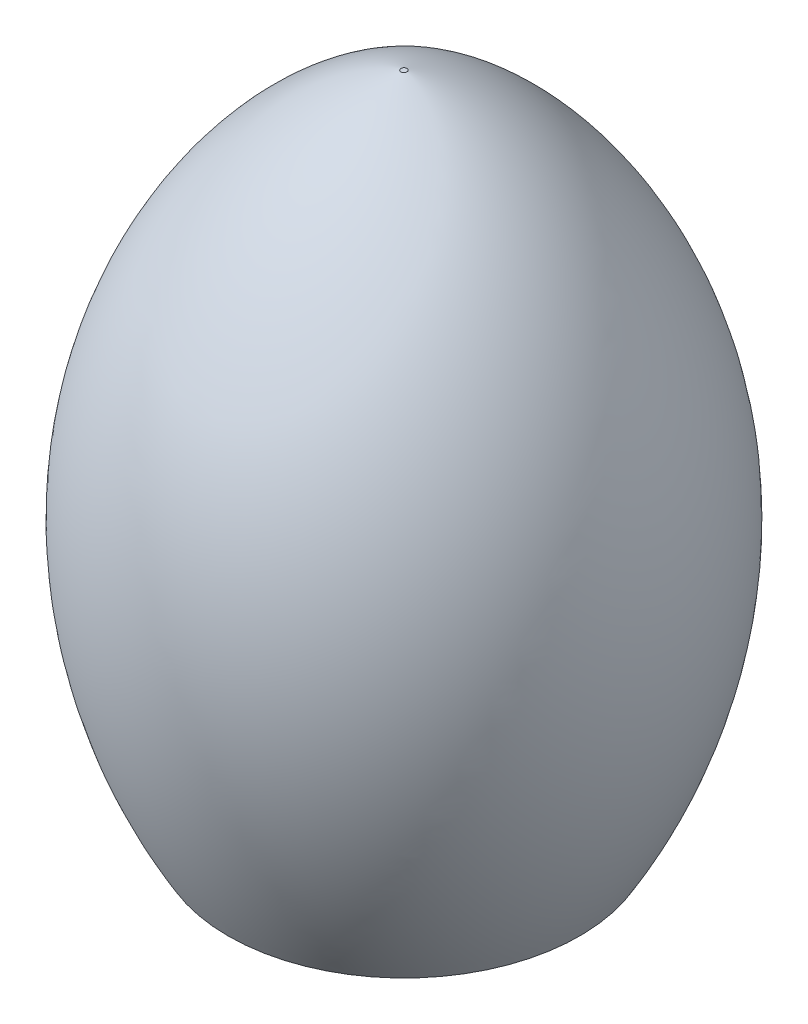
ISO-10303-21;
HEADER;
FILE_DESCRIPTION(('STEP AP214'),'2;1');
FILE_NAME('part.step','',(''),(''),'','','');
FILE_SCHEMA(('AUTOMOTIVE_DESIGN { 1 0 10303 214 1 1 1 1 }'));
ENDSEC;
DATA;
#1=APPLICATION_CONTEXT('core data for automotive mechanical design processes');
#2=APPLICATION_PROTOCOL_DEFINITION('international standard','automotive_design',2000,#1);
#3=PRODUCT_CONTEXT('',#1,'mechanical');
#4=PRODUCT('Part','Part','',(#3));
#5=PRODUCT_RELATED_PRODUCT_CATEGORY('part','',(#4));
#6=PRODUCT_DEFINITION_FORMATION('','',#4);
#7=PRODUCT_DEFINITION_CONTEXT('part definition',#1,'design');
#8=PRODUCT_DEFINITION('design','',#6,#7);
#9=PRODUCT_DEFINITION_SHAPE('','',#8);
#10=(LENGTH_UNIT() NAMED_UNIT(*) SI_UNIT(.MILLI.,.METRE.));
#11=(NAMED_UNIT(*) PLANE_ANGLE_UNIT() SI_UNIT($,.RADIAN.));
#12=(NAMED_UNIT(*) SI_UNIT($,.STERADIAN.) SOLID_ANGLE_UNIT());
#13=UNCERTAINTY_MEASURE_WITH_UNIT(LENGTH_MEASURE(1.E-05),#10,'distance_accuracy_value','');
#14=(GEOMETRIC_REPRESENTATION_CONTEXT(3) GLOBAL_UNCERTAINTY_ASSIGNED_CONTEXT((#13)) GLOBAL_UNIT_ASSIGNED_CONTEXT((#10,
#11,#12)) REPRESENTATION_CONTEXT('',''));
#15=CARTESIAN_POINT('',(0.,0.,0.));
#16=DIRECTION('',(0.,0.,1.));
#17=DIRECTION('',(1.,0.,0.));
#18=AXIS2_PLACEMENT_3D('',#15,#16,#17);
#19=CARTESIAN_POINT('',(0.,-156.440217310753,1.73358952312517));
#20=CARTESIAN_POINT('',(0.,-155.982540250555,1.99736031969315));
#21=CARTESIAN_POINT('',(0.,-155.075005504208,2.52166154879629));
#22=CARTESIAN_POINT('',(0.,-153.197381019125,3.59618691926529));
#23=CARTESIAN_POINT('',(0.,-149.898520111594,5.40853291107962));
#24=CARTESIAN_POINT('',(0.,-143.184195526544,8.8314438941949));
#25=CARTESIAN_POINT('',(0.,-133.320885589071,13.0915084510609));
#26=CARTESIAN_POINT('',(0.,-121.124330482223,17.1560298351578));
#27=CARTESIAN_POINT('',(0.,-104.498519625279,21.1044967516179));
#28=CARTESIAN_POINT('',(0.,-83.2463032424961,23.1522351838632));
#29=CARTESIAN_POINT('',(0.,-61.9420271551155,20.9857965337876));
#30=CARTESIAN_POINT('',(0.,-45.2360488326063,16.513939146641));
#31=CARTESIAN_POINT('',(0.,-28.8508969536115,10.1294094875408));
#32=CARTESIAN_POINT('',(0.,-13.3639018017232,0.917912268739273));
#33=CARTESIAN_POINT('',(0.,-0.0523508912760456,-10.8076029139682));
#34=CARTESIAN_POINT('',(0.,8.52414946827458,-20.7950562968071));
#35=CARTESIAN_POINT('',(0.,14.219192468324,-30.0608582533681));
#36=CARTESIAN_POINT('',(0.,17.7246072760641,-37.9888000394788));
#37=CARTESIAN_POINT('',(0.,19.1020344196853,-42.1349628048456));
#38=CARTESIAN_POINT('',(0.,19.6840745291793,-44.2319943927236));
#39=B_SPLINE_CURVE_WITH_KNOTS('',3,(#19,#20,#21,#22,#23,#24,#25,#26,#27,#28,#29,#30,#31,#32,#33,
#34,#35,#36,#37,#38),.UNSPECIFIED.,.F.,.F.,(4,1,1,1,1,1,1,1,1,1,1,1,1,1,1,1,1,4),
(-0.00861999079698822,-0.000740147118886745,0.00713969655921473,0.0228993839154177,
0.0544187586278235,0.117457508052635,0.180496257477447,0.243535006902259,0.369612505751882,
0.495690004601506,0.558728754026318,0.621767503451129,0.747845002300753,0.810883751725565,
0.873922501150377,0.936961250575188,0.968480625287594,1.),.UNSPECIFIED.);
#40=CARTESIAN_POINT('',(0.,16.7933542603554,-45.0343261990296));
#41=DIRECTION('',(0.,1.,0.));
#42=AXIS1_PLACEMENT('',#40,#41);
#43=SURFACE_OF_REVOLUTION('',#39,#42);
#44=CARTESIAN_POINT('',(0.,19.6840745291793,-45.0343261990296));
#45=DIRECTION('',(0.,1.,0.));
#46=DIRECTION('',(0.,0.,1.));
#47=AXIS2_PLACEMENT_3D('',#44,#45,#46);
#48=CIRCLE('',#47,0.802331806306046);
#49=CARTESIAN_POINT('',(0.,19.6840745291793,-44.2319943927236));
#50=VERTEX_POINT('',#49);
#51=EDGE_CURVE('E56',#50,#50,#48,.T.);
#52=ORIENTED_EDGE('',*,*,#51,.F.);
#53=EDGE_LOOP('',(#52));
#54=FACE_BOUND('',#53,.T.);
#55=CARTESIAN_POINT('',(0.,-156.440217310753,-45.0343261990296));
#56=DIRECTION('',(0.,1.,0.));
#57=DIRECTION('',(0.,0.,1.));
#58=AXIS2_PLACEMENT_3D('',#55,#56,#57);
#59=CIRCLE('',#58,46.7679157221548);
#60=CARTESIAN_POINT('',(0.,-156.440217310753,1.73358952312516));
#61=VERTEX_POINT('',#60);
#62=EDGE_CURVE('E11',#61,#61,#59,.T.);
#63=ORIENTED_EDGE('',*,*,#62,.T.);
#64=EDGE_LOOP('',(#63));
#65=FACE_BOUND('',#64,.T.);
#66=ADVANCED_FACE('F36',(#54,#65),#43,.T.);
#67=CARTESIAN_POINT('',(0.,-156.440217310753,0.));
#68=DIRECTION('',(0.,-1.,0.));
#69=DIRECTION('',(0.,0.,-1.));
#70=AXIS2_PLACEMENT_3D('',#67,#68,#69);
#71=PLANE('',#70);
#72=ORIENTED_EDGE('',*,*,#62,.F.);
#73=EDGE_LOOP('',(#72));
#74=FACE_BOUND('',#73,.T.);
#75=ADVANCED_FACE('F73',(#74),#71,.T.);
#76=CARTESIAN_POINT('',(0.,19.6840745291793,0.));
#77=DIRECTION('',(0.,1.,0.));
#78=DIRECTION('',(0.,0.,1.));
#79=AXIS2_PLACEMENT_3D('',#76,#77,#78);
#80=PLANE('',#79);
#81=ORIENTED_EDGE('',*,*,#51,.T.);
#82=EDGE_LOOP('',(#81));
#83=FACE_BOUND('',#82,.T.);
#84=ADVANCED_FACE('F71',(#83),#80,.T.);
#85=CLOSED_SHELL('',(#66,#75,#84));
#86=CARTESIAN_POINT('',(0.,-153.440217310753,0.));
#87=DIRECTION('',(0.,-1.,0.));
#88=DIRECTION('',(0.,0.,-1.));
#89=AXIS2_PLACEMENT_3D('',#86,#87,#88);
#90=PLANE('',#89);
#91=CARTESIAN_POINT('',(0.,-153.440217310753,-45.0343261990296));
#92=DIRECTION('',(0.,1.,0.));
#93=DIRECTION('',(0.,0.,1.));
#94=AXIS2_PLACEMENT_3D('',#91,#92,#93);
#95=CIRCLE('',#94,45.0343261990296);
#96=CARTESIAN_POINT('',(0.,-153.440217310753,0.));
#97=VERTEX_POINT('',#96);
#98=EDGE_CURVE('E44',#97,#97,#95,.T.);
#99=ORIENTED_EDGE('',*,*,#98,.T.);
#100=EDGE_LOOP('',(#99));
#101=FACE_BOUND('',#100,.T.);
#102=ADVANCED_FACE('F50',(#101),#90,.F.);
#103=CARTESIAN_POINT('',(0.,-153.440217310753,0.));
#104=CARTESIAN_POINT('',(0.,-119.065516598152,19.8110042588273));
#105=CARTESIAN_POINT('',(0.,-48.4643809876704,30.0289971577804));
#106=CARTESIAN_POINT('',(0.,9.57042121720031,-19.0108297053081));
#107=CARTESIAN_POINT('',(0.,16.7933542603554,-45.0343261990296));
#108=B_SPLINE_CURVE_WITH_KNOTS('',3,(#103,#104,#105,#106,#107),.UNSPECIFIED.,.F.,.F.,(4,1,4),
(0.,0.591830554014814,1.),.UNSPECIFIED.);
#109=CARTESIAN_POINT('',(0.,16.7933542603554,-45.0343261990296));
#110=DIRECTION('',(0.,1.,0.));
#111=AXIS1_PLACEMENT('',#109,#110);
#112=SURFACE_OF_REVOLUTION('',#108,#111);
#113=CARTESIAN_POINT('',(0.,16.7933542603554,-45.0343261990296));
#114=VERTEX_POINT('',#113);
#115=VERTEX_LOOP('',#114);
#116=FACE_BOUND('',#115,.T.);
#117=ORIENTED_EDGE('',*,*,#98,.F.);
#118=EDGE_LOOP('',(#117));
#119=FACE_BOUND('',#118,.T.);
#120=ADVANCED_FACE('F47',(#116,#119),#112,.F.);
#121=CLOSED_SHELL('',(#102,#120));
#122=ORIENTED_CLOSED_SHELL('',*,#121,.T.);
#123=BREP_WITH_VOIDS('B2',#85,(#122));
#124=ADVANCED_BREP_SHAPE_REPRESENTATION('',(#18,#123),#14);
#125=SHAPE_DEFINITION_REPRESENTATION(#9,#124);
ENDSEC;
END-ISO-10303-21;
